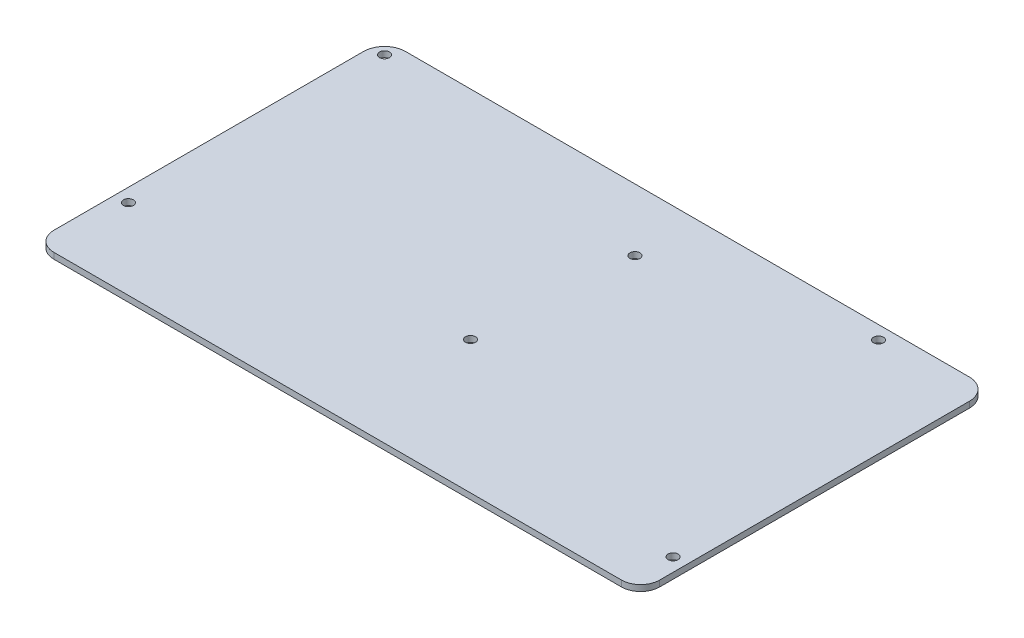
ISO-10303-21;
HEADER;
FILE_DESCRIPTION(('STEP AP214'),'2;1');
FILE_NAME('part.step','',(''),(''),'','','');
FILE_SCHEMA(('AUTOMOTIVE_DESIGN { 1 0 10303 214 1 1 1 1 }'));
ENDSEC;
DATA;
#1=APPLICATION_CONTEXT('core data for automotive mechanical design processes');
#2=APPLICATION_PROTOCOL_DEFINITION('international standard','automotive_design',2000,#1);
#3=PRODUCT_CONTEXT('',#1,'mechanical');
#4=PRODUCT('Part','Part','',(#3));
#5=PRODUCT_RELATED_PRODUCT_CATEGORY('part','',(#4));
#6=PRODUCT_DEFINITION_FORMATION('','',#4);
#7=PRODUCT_DEFINITION_CONTEXT('part definition',#1,'design');
#8=PRODUCT_DEFINITION('design','',#6,#7);
#9=PRODUCT_DEFINITION_SHAPE('','',#8);
#10=(LENGTH_UNIT() NAMED_UNIT(*) SI_UNIT(.MILLI.,.METRE.));
#11=(NAMED_UNIT(*) PLANE_ANGLE_UNIT() SI_UNIT($,.RADIAN.));
#12=(NAMED_UNIT(*) SI_UNIT($,.STERADIAN.) SOLID_ANGLE_UNIT());
#13=UNCERTAINTY_MEASURE_WITH_UNIT(LENGTH_MEASURE(1.E-05),#10,'distance_accuracy_value','');
#14=(GEOMETRIC_REPRESENTATION_CONTEXT(3) GLOBAL_UNCERTAINTY_ASSIGNED_CONTEXT((#13)) GLOBAL_UNIT_ASSIGNED_CONTEXT((#10,
#11,#12)) REPRESENTATION_CONTEXT('',''));
#15=CARTESIAN_POINT('',(0.,0.,0.));
#16=DIRECTION('',(0.,0.,1.));
#17=DIRECTION('',(1.,0.,0.));
#18=AXIS2_PLACEMENT_3D('',#15,#16,#17);
#19=CARTESIAN_POINT('',(0.,2.,0.));
#20=DIRECTION('',(0.,1.,0.));
#21=DIRECTION('',(0.,0.,1.));
#22=AXIS2_PLACEMENT_3D('',#19,#20,#21);
#23=PLANE('',#22);
#24=CARTESIAN_POINT('',(-97.45,2.,-95.57));
#25=DIRECTION('',(0.,1.,0.));
#26=DIRECTION('',(0.,0.,1.));
#27=AXIS2_PLACEMENT_3D('',#24,#25,#26);
#28=CIRCLE('',#27,1.65);
#29=CARTESIAN_POINT('',(-97.45,2.,-93.92));
#30=VERTEX_POINT('',#29);
#31=EDGE_CURVE('E207',#30,#30,#28,.T.);
#32=ORIENTED_EDGE('',*,*,#31,.F.);
#33=EDGE_LOOP('',(#32));
#34=FACE_BOUND('',#33,.T.);
#35=CARTESIAN_POINT('',(-32.71,2.,-111.76));
#36=DIRECTION('',(0.,1.,0.));
#37=DIRECTION('',(0.,0.,1.));
#38=AXIS2_PLACEMENT_3D('',#35,#36,#37);
#39=CIRCLE('',#38,1.65);
#40=CARTESIAN_POINT('',(-32.71,2.,-110.11));
#41=VERTEX_POINT('',#40);
#42=EDGE_CURVE('E195',#41,#41,#39,.T.);
#43=ORIENTED_EDGE('',*,*,#42,.F.);
#44=EDGE_LOOP('',(#43));
#45=FACE_BOUND('',#44,.T.);
#46=CARTESIAN_POINT('',(-196.83,2.,-26.67));
#47=DIRECTION('',(0.,1.,0.));
#48=DIRECTION('',(0.,0.,1.));
#49=AXIS2_PLACEMENT_3D('',#46,#47,#48);
#50=CIRCLE('',#49,1.65000000000002);
#51=CARTESIAN_POINT('',(-196.83,2.,-25.02));
#52=VERTEX_POINT('',#51);
#53=EDGE_CURVE('E133',#52,#52,#50,.T.);
#54=ORIENTED_EDGE('',*,*,#53,.F.);
#55=EDGE_LOOP('',(#54));
#56=FACE_BOUND('',#55,.T.);
#57=DIRECTION('',(1.,0.,0.));
#58=VECTOR('',#57,1.);
#59=CARTESIAN_POINT('',(0.,2.,0.));
#60=LINE('',#59,#58);
#61=CARTESIAN_POINT('',(-194.93,2.,0.));
#62=VERTEX_POINT('',#61);
#63=CARTESIAN_POINT('',(-6.35,2.,0.));
#64=VERTEX_POINT('',#63);
#65=EDGE_CURVE('E139',#62,#64,#60,.T.);
#66=ORIENTED_EDGE('',*,*,#65,.T.);
#67=CARTESIAN_POINT('',(-6.35,2.,-6.35));
#68=DIRECTION('',(0.,1.,0.));
#69=DIRECTION('',(0.,0.,1.));
#70=AXIS2_PLACEMENT_3D('',#67,#68,#69);
#71=CIRCLE('',#70,6.35);
#72=CARTESIAN_POINT('',(0.,2.,-6.35));
#73=VERTEX_POINT('',#72);
#74=EDGE_CURVE('E43',#64,#73,#71,.T.);
#75=ORIENTED_EDGE('',*,*,#74,.T.);
#76=DIRECTION('',(0.,0.,-1.));
#77=VECTOR('',#76,1.);
#78=CARTESIAN_POINT('',(0.,2.,0.));
#79=LINE('',#78,#77);
#80=CARTESIAN_POINT('',(0.,2.,-109.23));
#81=VERTEX_POINT('',#80);
#82=EDGE_CURVE('E138',#73,#81,#79,.T.);
#83=ORIENTED_EDGE('',*,*,#82,.T.);
#84=CARTESIAN_POINT('',(-6.98,2.,-109.23));
#85=DIRECTION('',(0.,1.,0.));
#86=DIRECTION('',(0.,0.,1.));
#87=AXIS2_PLACEMENT_3D('',#84,#85,#86);
#88=CIRCLE('',#87,6.98);
#89=CARTESIAN_POINT('',(-6.98,2.,-116.21));
#90=VERTEX_POINT('',#89);
#91=EDGE_CURVE('E145',#81,#90,#88,.T.);
#92=ORIENTED_EDGE('',*,*,#91,.T.);
#93=DIRECTION('',(-1.,0.,0.));
#94=VECTOR('',#93,1.);
#95=CARTESIAN_POINT('',(0.,2.,-116.21));
#96=LINE('',#95,#94);
#97=CARTESIAN_POINT('',(-194.3,2.,-116.21));
#98=VERTEX_POINT('',#97);
#99=EDGE_CURVE('E122',#90,#98,#96,.T.);
#100=ORIENTED_EDGE('',*,*,#99,.T.);
#101=CARTESIAN_POINT('',(-194.3,2.,-109.23));
#102=DIRECTION('',(0.,1.,0.));
#103=DIRECTION('',(0.,0.,1.));
#104=AXIS2_PLACEMENT_3D('',#101,#102,#103);
#105=CIRCLE('',#104,6.98);
#106=CARTESIAN_POINT('',(-201.28,2.,-109.23));
#107=VERTEX_POINT('',#106);
#108=EDGE_CURVE('E143',#98,#107,#105,.T.);
#109=ORIENTED_EDGE('',*,*,#108,.T.);
#110=DIRECTION('',(0.,0.,1.));
#111=VECTOR('',#110,1.);
#112=CARTESIAN_POINT('',(-201.28,2.,0.));
#113=LINE('',#112,#111);
#114=CARTESIAN_POINT('',(-201.28,2.,-6.34999999999997));
#115=VERTEX_POINT('',#114);
#116=EDGE_CURVE('E179',#107,#115,#113,.T.);
#117=ORIENTED_EDGE('',*,*,#116,.T.);
#118=CARTESIAN_POINT('',(-194.93,2.,-6.34999999999998));
#119=DIRECTION('',(0.,1.,0.));
#120=DIRECTION('',(0.,0.,1.));
#121=AXIS2_PLACEMENT_3D('',#118,#119,#120);
#122=CIRCLE('',#121,6.35);
#123=EDGE_CURVE('E161',#115,#62,#122,.T.);
#124=ORIENTED_EDGE('',*,*,#123,.T.);
#125=EDGE_LOOP('',(#66,#75,#83,#92,#100,#109,#117,#124));
#126=FACE_BOUND('',#125,.T.);
#127=CARTESIAN_POINT('',(-196.83,2.,-111.76));
#128=DIRECTION('',(0.,1.,0.));
#129=DIRECTION('',(0.,0.,1.));
#130=AXIS2_PLACEMENT_3D('',#127,#128,#129);
#131=CIRCLE('',#130,1.65000000000002);
#132=CARTESIAN_POINT('',(-196.83,2.,-110.11));
#133=VERTEX_POINT('',#132);
#134=EDGE_CURVE('E189',#133,#133,#131,.T.);
#135=ORIENTED_EDGE('',*,*,#134,.F.);
#136=EDGE_LOOP('',(#135));
#137=FACE_BOUND('',#136,.T.);
#138=CARTESIAN_POINT('',(-4.45,2.,-15.24));
#139=DIRECTION('',(0.,1.,0.));
#140=DIRECTION('',(0.,0.,1.));
#141=AXIS2_PLACEMENT_3D('',#138,#139,#140);
#142=CIRCLE('',#141,1.65);
#143=CARTESIAN_POINT('',(-4.45,2.,-13.59));
#144=VERTEX_POINT('',#143);
#145=EDGE_CURVE('E201',#144,#144,#142,.T.);
#146=ORIENTED_EDGE('',*,*,#145,.F.);
#147=EDGE_LOOP('',(#146));
#148=FACE_BOUND('',#147,.T.);
#149=CARTESIAN_POINT('',(-100.63,2.,-44.13));
#150=DIRECTION('',(0.,1.,0.));
#151=DIRECTION('',(0.,0.,1.));
#152=AXIS2_PLACEMENT_3D('',#149,#150,#151);
#153=CIRCLE('',#152,1.65);
#154=CARTESIAN_POINT('',(-100.63,2.,-42.48));
#155=VERTEX_POINT('',#154);
#156=EDGE_CURVE('E213',#155,#155,#153,.T.);
#157=ORIENTED_EDGE('',*,*,#156,.F.);
#158=EDGE_LOOP('',(#157));
#159=FACE_BOUND('',#158,.T.);
#160=ADVANCED_FACE('F35',(#34,#45,#56,#126,#137,#148,#159),#23,.T.);
#161=CARTESIAN_POINT('',(0.,0.,0.));
#162=DIRECTION('',(0.,1.,0.));
#163=DIRECTION('',(0.,0.,1.));
#164=AXIS2_PLACEMENT_3D('',#161,#162,#163);
#165=PLANE('',#164);
#166=DIRECTION('',(0.,0.,-1.));
#167=VECTOR('',#166,1.);
#168=CARTESIAN_POINT('',(0.,0.,0.));
#169=LINE('',#168,#167);
#170=CARTESIAN_POINT('',(0.,0.,-6.35));
#171=VERTEX_POINT('',#170);
#172=CARTESIAN_POINT('',(0.,0.,-109.23));
#173=VERTEX_POINT('',#172);
#174=EDGE_CURVE('E129',#171,#173,#169,.T.);
#175=ORIENTED_EDGE('',*,*,#174,.F.);
#176=CARTESIAN_POINT('',(-6.35,0.,-6.35));
#177=DIRECTION('',(0.,1.,0.));
#178=DIRECTION('',(0.,0.,1.));
#179=AXIS2_PLACEMENT_3D('',#176,#177,#178);
#180=CIRCLE('',#179,6.35);
#181=CARTESIAN_POINT('',(-6.35,0.,0.));
#182=VERTEX_POINT('',#181);
#183=EDGE_CURVE('E155',#171,#182,#180,.F.);
#184=ORIENTED_EDGE('',*,*,#183,.T.);
#185=DIRECTION('',(1.,0.,0.));
#186=VECTOR('',#185,1.);
#187=CARTESIAN_POINT('',(0.,0.,0.));
#188=LINE('',#187,#186);
#189=CARTESIAN_POINT('',(-194.93,0.,0.));
#190=VERTEX_POINT('',#189);
#191=EDGE_CURVE('E131',#190,#182,#188,.T.);
#192=ORIENTED_EDGE('',*,*,#191,.F.);
#193=CARTESIAN_POINT('',(-194.93,0.,-6.34999999999998));
#194=DIRECTION('',(0.,1.,0.));
#195=DIRECTION('',(0.,0.,1.));
#196=AXIS2_PLACEMENT_3D('',#193,#194,#195);
#197=CIRCLE('',#196,6.35);
#198=CARTESIAN_POINT('',(-201.28,0.,-6.34999999999997));
#199=VERTEX_POINT('',#198);
#200=EDGE_CURVE('E153',#190,#199,#197,.F.);
#201=ORIENTED_EDGE('',*,*,#200,.T.);
#202=DIRECTION('',(0.,0.,1.));
#203=VECTOR('',#202,1.);
#204=CARTESIAN_POINT('',(-201.28,0.,0.));
#205=LINE('',#204,#203);
#206=CARTESIAN_POINT('',(-201.28,0.,-109.23));
#207=VERTEX_POINT('',#206);
#208=EDGE_CURVE('E128',#207,#199,#205,.T.);
#209=ORIENTED_EDGE('',*,*,#208,.F.);
#210=CARTESIAN_POINT('',(-194.3,0.,-109.23));
#211=DIRECTION('',(0.,1.,0.));
#212=DIRECTION('',(0.,0.,1.));
#213=AXIS2_PLACEMENT_3D('',#210,#211,#212);
#214=CIRCLE('',#213,6.98);
#215=CARTESIAN_POINT('',(-194.3,0.,-116.21));
#216=VERTEX_POINT('',#215);
#217=EDGE_CURVE('E113',#207,#216,#214,.F.);
#218=ORIENTED_EDGE('',*,*,#217,.T.);
#219=DIRECTION('',(-1.,0.,0.));
#220=VECTOR('',#219,1.);
#221=CARTESIAN_POINT('',(0.,0.,-116.21));
#222=LINE('',#221,#220);
#223=CARTESIAN_POINT('',(-6.98,0.,-116.21));
#224=VERTEX_POINT('',#223);
#225=EDGE_CURVE('E119',#224,#216,#222,.T.);
#226=ORIENTED_EDGE('',*,*,#225,.F.);
#227=CARTESIAN_POINT('',(-6.98,0.,-109.23));
#228=DIRECTION('',(0.,1.,0.));
#229=DIRECTION('',(0.,0.,1.));
#230=AXIS2_PLACEMENT_3D('',#227,#228,#229);
#231=CIRCLE('',#230,6.98);
#232=EDGE_CURVE('E103',#224,#173,#231,.F.);
#233=ORIENTED_EDGE('',*,*,#232,.T.);
#234=EDGE_LOOP('',(#175,#184,#192,#201,#209,#218,#226,#233));
#235=FACE_BOUND('',#234,.T.);
#236=CARTESIAN_POINT('',(-196.83,0.,-26.67));
#237=DIRECTION('',(0.,1.,0.));
#238=DIRECTION('',(0.,0.,1.));
#239=AXIS2_PLACEMENT_3D('',#236,#237,#238);
#240=CIRCLE('',#239,1.65000000000002);
#241=CARTESIAN_POINT('',(-196.83,0.,-25.02));
#242=VERTEX_POINT('',#241);
#243=EDGE_CURVE('E186',#242,#242,#240,.T.);
#244=ORIENTED_EDGE('',*,*,#243,.T.);
#245=EDGE_LOOP('',(#244));
#246=FACE_BOUND('',#245,.T.);
#247=CARTESIAN_POINT('',(-196.83,0.,-111.76));
#248=DIRECTION('',(0.,1.,0.));
#249=DIRECTION('',(0.,0.,1.));
#250=AXIS2_PLACEMENT_3D('',#247,#248,#249);
#251=CIRCLE('',#250,1.65000000000002);
#252=CARTESIAN_POINT('',(-196.83,0.,-110.11));
#253=VERTEX_POINT('',#252);
#254=EDGE_CURVE('E192',#253,#253,#251,.T.);
#255=ORIENTED_EDGE('',*,*,#254,.T.);
#256=EDGE_LOOP('',(#255));
#257=FACE_BOUND('',#256,.T.);
#258=CARTESIAN_POINT('',(-32.71,0.,-111.76));
#259=DIRECTION('',(0.,1.,0.));
#260=DIRECTION('',(0.,0.,1.));
#261=AXIS2_PLACEMENT_3D('',#258,#259,#260);
#262=CIRCLE('',#261,1.65);
#263=CARTESIAN_POINT('',(-32.71,0.,-110.11));
#264=VERTEX_POINT('',#263);
#265=EDGE_CURVE('E198',#264,#264,#262,.T.);
#266=ORIENTED_EDGE('',*,*,#265,.T.);
#267=EDGE_LOOP('',(#266));
#268=FACE_BOUND('',#267,.T.);
#269=CARTESIAN_POINT('',(-4.45,0.,-15.24));
#270=DIRECTION('',(0.,1.,0.));
#271=DIRECTION('',(0.,0.,1.));
#272=AXIS2_PLACEMENT_3D('',#269,#270,#271);
#273=CIRCLE('',#272,1.65);
#274=CARTESIAN_POINT('',(-4.45,0.,-13.59));
#275=VERTEX_POINT('',#274);
#276=EDGE_CURVE('E204',#275,#275,#273,.T.);
#277=ORIENTED_EDGE('',*,*,#276,.T.);
#278=EDGE_LOOP('',(#277));
#279=FACE_BOUND('',#278,.T.);
#280=CARTESIAN_POINT('',(-97.45,0.,-95.57));
#281=DIRECTION('',(0.,1.,0.));
#282=DIRECTION('',(0.,0.,1.));
#283=AXIS2_PLACEMENT_3D('',#280,#281,#282);
#284=CIRCLE('',#283,1.65);
#285=CARTESIAN_POINT('',(-97.45,0.,-93.92));
#286=VERTEX_POINT('',#285);
#287=EDGE_CURVE('E210',#286,#286,#284,.T.);
#288=ORIENTED_EDGE('',*,*,#287,.T.);
#289=EDGE_LOOP('',(#288));
#290=FACE_BOUND('',#289,.T.);
#291=CARTESIAN_POINT('',(-100.63,0.,-44.13));
#292=DIRECTION('',(0.,1.,0.));
#293=DIRECTION('',(0.,0.,1.));
#294=AXIS2_PLACEMENT_3D('',#291,#292,#293);
#295=CIRCLE('',#294,1.65);
#296=CARTESIAN_POINT('',(-100.63,0.,-42.48));
#297=VERTEX_POINT('',#296);
#298=EDGE_CURVE('E216',#297,#297,#295,.T.);
#299=ORIENTED_EDGE('',*,*,#298,.T.);
#300=EDGE_LOOP('',(#299));
#301=FACE_BOUND('',#300,.T.);
#302=ADVANCED_FACE('F125',(#235,#246,#257,#268,#279,#290,#301),#165,.F.);
#303=CARTESIAN_POINT('',(0.,2.,0.));
#304=DIRECTION('',(-1.,0.,0.));
#305=DIRECTION('',(0.,0.,1.));
#306=AXIS2_PLACEMENT_3D('',#303,#304,#305);
#307=PLANE('',#306);
#308=ORIENTED_EDGE('',*,*,#82,.F.);
#309=DIRECTION('',(0.,-1.,0.));
#310=VECTOR('',#309,1.);
#311=CARTESIAN_POINT('',(0.,2.,-6.35));
#312=LINE('',#311,#310);
#313=EDGE_CURVE('E150',#73,#171,#312,.T.);
#314=ORIENTED_EDGE('',*,*,#313,.T.);
#315=ORIENTED_EDGE('',*,*,#174,.T.);
#316=DIRECTION('',(0.,-1.,0.));
#317=VECTOR('',#316,1.);
#318=CARTESIAN_POINT('',(0.,2.,-109.23));
#319=LINE('',#318,#317);
#320=EDGE_CURVE('E109',#173,#81,#319,.F.);
#321=ORIENTED_EDGE('',*,*,#320,.T.);
#322=EDGE_LOOP('',(#308,#314,#315,#321));
#323=FACE_BOUND('',#322,.T.);
#324=ADVANCED_FACE('F169',(#323),#307,.F.);
#325=CARTESIAN_POINT('',(0.,2.,-116.21));
#326=DIRECTION('',(0.,0.,1.));
#327=DIRECTION('',(1.,0.,0.));
#328=AXIS2_PLACEMENT_3D('',#325,#326,#327);
#329=PLANE('',#328);
#330=ORIENTED_EDGE('',*,*,#99,.F.);
#331=DIRECTION('',(0.,-1.,0.));
#332=VECTOR('',#331,1.);
#333=CARTESIAN_POINT('',(-6.98,2.,-116.21));
#334=LINE('',#333,#332);
#335=EDGE_CURVE('E107',#90,#224,#334,.T.);
#336=ORIENTED_EDGE('',*,*,#335,.T.);
#337=ORIENTED_EDGE('',*,*,#225,.T.);
#338=DIRECTION('',(0.,-1.,0.));
#339=VECTOR('',#338,1.);
#340=CARTESIAN_POINT('',(-194.3,2.,-116.21));
#341=LINE('',#340,#339);
#342=EDGE_CURVE('E123',#216,#98,#341,.F.);
#343=ORIENTED_EDGE('',*,*,#342,.T.);
#344=EDGE_LOOP('',(#330,#336,#337,#343));
#345=FACE_BOUND('',#344,.T.);
#346=ADVANCED_FACE('F118',(#345),#329,.F.);
#347=CARTESIAN_POINT('',(-201.28,2.,0.));
#348=DIRECTION('',(1.,0.,0.));
#349=DIRECTION('',(0.,0.,-1.));
#350=AXIS2_PLACEMENT_3D('',#347,#348,#349);
#351=PLANE('',#350);
#352=ORIENTED_EDGE('',*,*,#208,.T.);
#353=DIRECTION('',(0.,-1.,0.));
#354=VECTOR('',#353,1.);
#355=CARTESIAN_POINT('',(-201.28,2.,-6.34999999999998));
#356=LINE('',#355,#354);
#357=EDGE_CURVE('E11',#199,#115,#356,.F.);
#358=ORIENTED_EDGE('',*,*,#357,.T.);
#359=ORIENTED_EDGE('',*,*,#116,.F.);
#360=DIRECTION('',(0.,-1.,0.));
#361=VECTOR('',#360,1.);
#362=CARTESIAN_POINT('',(-201.28,2.,-109.23));
#363=LINE('',#362,#361);
#364=EDGE_CURVE('E147',#107,#207,#363,.T.);
#365=ORIENTED_EDGE('',*,*,#364,.T.);
#366=EDGE_LOOP('',(#352,#358,#359,#365));
#367=FACE_BOUND('',#366,.T.);
#368=ADVANCED_FACE('F177',(#367),#351,.F.);
#369=CARTESIAN_POINT('',(0.,2.,0.));
#370=DIRECTION('',(0.,0.,-1.));
#371=DIRECTION('',(-1.,0.,0.));
#372=AXIS2_PLACEMENT_3D('',#369,#370,#371);
#373=PLANE('',#372);
#374=ORIENTED_EDGE('',*,*,#191,.T.);
#375=DIRECTION('',(0.,-1.,0.));
#376=VECTOR('',#375,1.);
#377=CARTESIAN_POINT('',(-6.35,2.,0.));
#378=LINE('',#377,#376);
#379=EDGE_CURVE('E56',#182,#64,#378,.F.);
#380=ORIENTED_EDGE('',*,*,#379,.T.);
#381=ORIENTED_EDGE('',*,*,#65,.F.);
#382=DIRECTION('',(0.,-1.,0.));
#383=VECTOR('',#382,1.);
#384=CARTESIAN_POINT('',(-194.93,2.,0.));
#385=LINE('',#384,#383);
#386=EDGE_CURVE('E157',#62,#190,#385,.T.);
#387=ORIENTED_EDGE('',*,*,#386,.T.);
#388=EDGE_LOOP('',(#374,#380,#381,#387));
#389=FACE_BOUND('',#388,.T.);
#390=ADVANCED_FACE('F173',(#389),#373,.F.);
#391=CARTESIAN_POINT('',(-196.83,2.,-26.67));
#392=DIRECTION('',(0.,-1.,0.));
#393=DIRECTION('',(0.,0.,-1.));
#394=AXIS2_PLACEMENT_3D('',#391,#392,#393);
#395=CYLINDRICAL_SURFACE('',#394,1.65000000000002);
#396=ORIENTED_EDGE('',*,*,#53,.T.);
#397=EDGE_LOOP('',(#396));
#398=FACE_BOUND('',#397,.T.);
#399=ORIENTED_EDGE('',*,*,#243,.F.);
#400=EDGE_LOOP('',(#399));
#401=FACE_BOUND('',#400,.T.);
#402=ADVANCED_FACE('F235',(#398,#401),#395,.F.);
#403=CARTESIAN_POINT('',(-196.83,2.,-111.76));
#404=DIRECTION('',(0.,-1.,0.));
#405=DIRECTION('',(0.,0.,-1.));
#406=AXIS2_PLACEMENT_3D('',#403,#404,#405);
#407=CYLINDRICAL_SURFACE('',#406,1.65000000000002);
#408=ORIENTED_EDGE('',*,*,#134,.T.);
#409=EDGE_LOOP('',(#408));
#410=FACE_BOUND('',#409,.T.);
#411=ORIENTED_EDGE('',*,*,#254,.F.);
#412=EDGE_LOOP('',(#411));
#413=FACE_BOUND('',#412,.T.);
#414=ADVANCED_FACE('F345',(#410,#413),#407,.F.);
#415=CARTESIAN_POINT('',(-32.71,2.,-111.76));
#416=DIRECTION('',(0.,-1.,0.));
#417=DIRECTION('',(0.,0.,-1.));
#418=AXIS2_PLACEMENT_3D('',#415,#416,#417);
#419=CYLINDRICAL_SURFACE('',#418,1.65);
#420=ORIENTED_EDGE('',*,*,#42,.T.);
#421=EDGE_LOOP('',(#420));
#422=FACE_BOUND('',#421,.T.);
#423=ORIENTED_EDGE('',*,*,#265,.F.);
#424=EDGE_LOOP('',(#423));
#425=FACE_BOUND('',#424,.T.);
#426=ADVANCED_FACE('F335',(#422,#425),#419,.F.);
#427=CARTESIAN_POINT('',(-4.45,2.,-15.24));
#428=DIRECTION('',(0.,-1.,0.));
#429=DIRECTION('',(0.,0.,-1.));
#430=AXIS2_PLACEMENT_3D('',#427,#428,#429);
#431=CYLINDRICAL_SURFACE('',#430,1.65);
#432=ORIENTED_EDGE('',*,*,#145,.T.);
#433=EDGE_LOOP('',(#432));
#434=FACE_BOUND('',#433,.T.);
#435=ORIENTED_EDGE('',*,*,#276,.F.);
#436=EDGE_LOOP('',(#435));
#437=FACE_BOUND('',#436,.T.);
#438=ADVANCED_FACE('F325',(#434,#437),#431,.F.);
#439=CARTESIAN_POINT('',(-97.45,2.,-95.57));
#440=DIRECTION('',(0.,-1.,0.));
#441=DIRECTION('',(0.,0.,-1.));
#442=AXIS2_PLACEMENT_3D('',#439,#440,#441);
#443=CYLINDRICAL_SURFACE('',#442,1.65);
#444=ORIENTED_EDGE('',*,*,#31,.T.);
#445=EDGE_LOOP('',(#444));
#446=FACE_BOUND('',#445,.T.);
#447=ORIENTED_EDGE('',*,*,#287,.F.);
#448=EDGE_LOOP('',(#447));
#449=FACE_BOUND('',#448,.T.);
#450=ADVANCED_FACE('F316',(#446,#449),#443,.F.);
#451=CARTESIAN_POINT('',(-100.63,2.,-44.13));
#452=DIRECTION('',(0.,-1.,0.));
#453=DIRECTION('',(0.,0.,-1.));
#454=AXIS2_PLACEMENT_3D('',#451,#452,#453);
#455=CYLINDRICAL_SURFACE('',#454,1.65);
#456=ORIENTED_EDGE('',*,*,#156,.T.);
#457=EDGE_LOOP('',(#456));
#458=FACE_BOUND('',#457,.T.);
#459=ORIENTED_EDGE('',*,*,#298,.F.);
#460=EDGE_LOOP('',(#459));
#461=FACE_BOUND('',#460,.T.);
#462=ADVANCED_FACE('F222',(#458,#461),#455,.F.);
#463=CARTESIAN_POINT('',(-6.98,2.,-109.23));
#464=DIRECTION('',(0.,-1.,0.));
#465=DIRECTION('',(0.,0.,-1.));
#466=AXIS2_PLACEMENT_3D('',#463,#464,#465);
#467=CYLINDRICAL_SURFACE('',#466,6.98);
#468=ORIENTED_EDGE('',*,*,#91,.F.);
#469=ORIENTED_EDGE('',*,*,#320,.F.);
#470=ORIENTED_EDGE('',*,*,#232,.F.);
#471=ORIENTED_EDGE('',*,*,#335,.F.);
#472=EDGE_LOOP('',(#468,#469,#470,#471));
#473=FACE_BOUND('',#472,.T.);
#474=ADVANCED_FACE('F106',(#473),#467,.T.);
#475=CARTESIAN_POINT('',(-194.3,2.,-109.23));
#476=DIRECTION('',(0.,-1.,0.));
#477=DIRECTION('',(0.,0.,-1.));
#478=AXIS2_PLACEMENT_3D('',#475,#476,#477);
#479=CYLINDRICAL_SURFACE('',#478,6.98);
#480=ORIENTED_EDGE('',*,*,#108,.F.);
#481=ORIENTED_EDGE('',*,*,#342,.F.);
#482=ORIENTED_EDGE('',*,*,#217,.F.);
#483=ORIENTED_EDGE('',*,*,#364,.F.);
#484=EDGE_LOOP('',(#480,#481,#482,#483));
#485=FACE_BOUND('',#484,.T.);
#486=ADVANCED_FACE('F182',(#485),#479,.T.);
#487=CARTESIAN_POINT('',(-6.35,2.,-6.35));
#488=DIRECTION('',(0.,-1.,0.));
#489=DIRECTION('',(0.,0.,-1.));
#490=AXIS2_PLACEMENT_3D('',#487,#488,#489);
#491=CYLINDRICAL_SURFACE('',#490,6.35);
#492=ORIENTED_EDGE('',*,*,#74,.F.);
#493=ORIENTED_EDGE('',*,*,#379,.F.);
#494=ORIENTED_EDGE('',*,*,#183,.F.);
#495=ORIENTED_EDGE('',*,*,#313,.F.);
#496=EDGE_LOOP('',(#492,#493,#494,#495));
#497=FACE_BOUND('',#496,.T.);
#498=ADVANCED_FACE('F171',(#497),#491,.T.);
#499=CARTESIAN_POINT('',(-194.93,2.,-6.34999999999998));
#500=DIRECTION('',(0.,-1.,0.));
#501=DIRECTION('',(0.,0.,-1.));
#502=AXIS2_PLACEMENT_3D('',#499,#500,#501);
#503=CYLINDRICAL_SURFACE('',#502,6.35);
#504=ORIENTED_EDGE('',*,*,#123,.F.);
#505=ORIENTED_EDGE('',*,*,#357,.F.);
#506=ORIENTED_EDGE('',*,*,#200,.F.);
#507=ORIENTED_EDGE('',*,*,#386,.F.);
#508=EDGE_LOOP('',(#504,#505,#506,#507));
#509=FACE_BOUND('',#508,.T.);
#510=ADVANCED_FACE('F37',(#509),#503,.T.);
#511=CLOSED_SHELL('',(#160,#302,#324,#346,#368,#390,#402,#414,#426,#438,#450,#462,#474,#486,
#498,#510));
#512=MANIFOLD_SOLID_BREP('B2',#511);
#513=ADVANCED_BREP_SHAPE_REPRESENTATION('',(#18,#512),#14);
#514=SHAPE_DEFINITION_REPRESENTATION(#9,#513);
ENDSEC;
END-ISO-10303-21;
